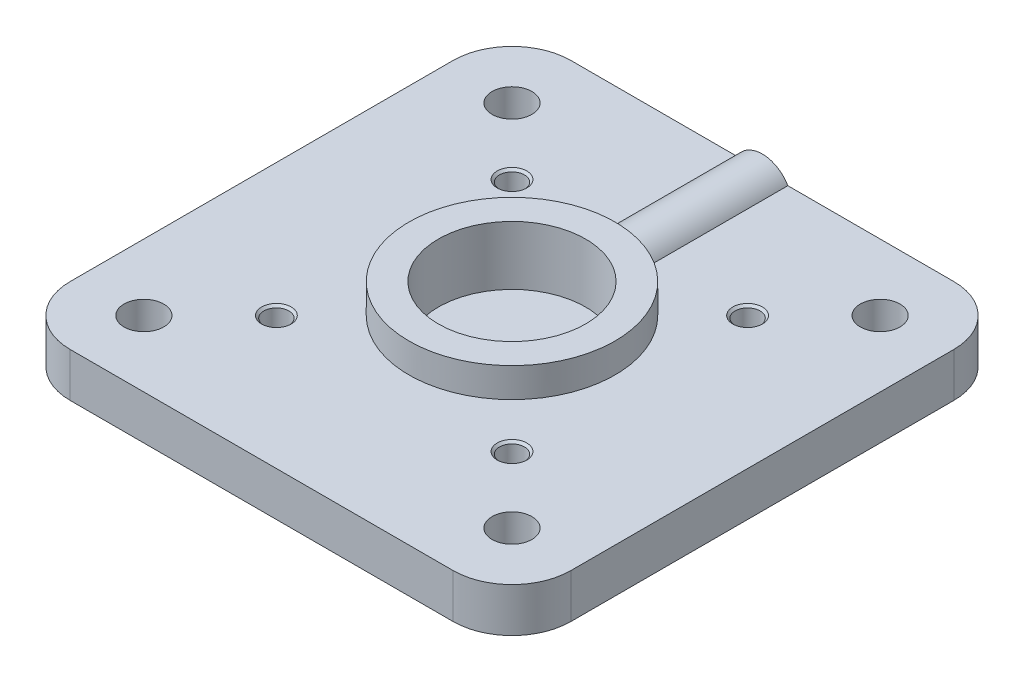
ISO-10303-21;
HEADER;
FILE_DESCRIPTION(('STEP AP214'),'2;1');
FILE_NAME('part.step','',(''),(''),'','','');
FILE_SCHEMA(('AUTOMOTIVE_DESIGN { 1 0 10303 214 1 1 1 1 }'));
ENDSEC;
DATA;
#1=APPLICATION_CONTEXT('core data for automotive mechanical design processes');
#2=APPLICATION_PROTOCOL_DEFINITION('international standard','automotive_design',2000,#1);
#3=PRODUCT_CONTEXT('',#1,'mechanical');
#4=PRODUCT('Part','Part','',(#3));
#5=PRODUCT_RELATED_PRODUCT_CATEGORY('part','',(#4));
#6=PRODUCT_DEFINITION_FORMATION('','',#4);
#7=PRODUCT_DEFINITION_CONTEXT('part definition',#1,'design');
#8=PRODUCT_DEFINITION('design','',#6,#7);
#9=PRODUCT_DEFINITION_SHAPE('','',#8);
#10=(LENGTH_UNIT() NAMED_UNIT(*) SI_UNIT(.MILLI.,.METRE.));
#11=(NAMED_UNIT(*) PLANE_ANGLE_UNIT() SI_UNIT($,.RADIAN.));
#12=(NAMED_UNIT(*) SI_UNIT($,.STERADIAN.) SOLID_ANGLE_UNIT());
#13=UNCERTAINTY_MEASURE_WITH_UNIT(LENGTH_MEASURE(1.E-05),#10,'distance_accuracy_value','');
#14=(GEOMETRIC_REPRESENTATION_CONTEXT(3) GLOBAL_UNCERTAINTY_ASSIGNED_CONTEXT((#13)) GLOBAL_UNIT_ASSIGNED_CONTEXT((#10,
#11,#12)) REPRESENTATION_CONTEXT('',''));
#15=CARTESIAN_POINT('',(0.,0.,0.));
#16=DIRECTION('',(0.,0.,1.));
#17=DIRECTION('',(1.,0.,0.));
#18=AXIS2_PLACEMENT_3D('',#15,#16,#17);
#19=CARTESIAN_POINT('',(-65.,15.,65.));
#20=DIRECTION('',(0.,-1.,0.));
#21=DIRECTION('',(0.,0.,-1.));
#22=AXIS2_PLACEMENT_3D('',#19,#20,#21);
#23=CYLINDRICAL_SURFACE('',#22,20.);
#24=CARTESIAN_POINT('',(-65.,0.,65.));
#25=DIRECTION('',(0.,1.,0.));
#26=DIRECTION('',(0.,0.,1.));
#27=AXIS2_PLACEMENT_3D('',#24,#25,#26);
#28=CIRCLE('',#27,20.);
#29=CARTESIAN_POINT('',(-85.,0.,64.9999999999999));
#30=VERTEX_POINT('',#29);
#31=CARTESIAN_POINT('',(-64.9999999999999,0.,85.));
#32=VERTEX_POINT('',#31);
#33=EDGE_CURVE('E157',#30,#32,#28,.T.);
#34=ORIENTED_EDGE('',*,*,#33,.T.);
#35=DIRECTION('',(0.,-1.,0.));
#36=VECTOR('',#35,1.);
#37=CARTESIAN_POINT('',(-64.9999999999999,15.,85.));
#38=LINE('',#37,#36);
#39=CARTESIAN_POINT('',(-64.9999999999999,15.,85.));
#40=VERTEX_POINT('',#39);
#41=EDGE_CURVE('E50',#40,#32,#38,.T.);
#42=ORIENTED_EDGE('',*,*,#41,.F.);
#43=CARTESIAN_POINT('',(-65.,15.,65.));
#44=DIRECTION('',(0.,1.,0.));
#45=DIRECTION('',(0.,0.,1.));
#46=AXIS2_PLACEMENT_3D('',#43,#44,#45);
#47=CIRCLE('',#46,20.);
#48=CARTESIAN_POINT('',(-85.,15.,64.9999999999999));
#49=VERTEX_POINT('',#48);
#50=EDGE_CURVE('E173',#49,#40,#47,.T.);
#51=ORIENTED_EDGE('',*,*,#50,.F.);
#52=DIRECTION('',(0.,-1.,0.));
#53=VECTOR('',#52,1.);
#54=CARTESIAN_POINT('',(-85.,15.,64.9999999999999));
#55=LINE('',#54,#53);
#56=EDGE_CURVE('E152',#49,#30,#55,.T.);
#57=ORIENTED_EDGE('',*,*,#56,.T.);
#58=EDGE_LOOP('',(#34,#42,#51,#57));
#59=FACE_BOUND('',#58,.T.);
#60=ADVANCED_FACE('F40',(#59),#23,.T.);
#61=CARTESIAN_POINT('',(-64.9999999999999,15.,85.));
#62=DIRECTION('',(0.,0.,-1.));
#63=DIRECTION('',(-1.,0.,0.));
#64=AXIS2_PLACEMENT_3D('',#61,#62,#63);
#65=PLANE('',#64);
#66=DIRECTION('',(1.,0.,0.));
#67=VECTOR('',#66,1.);
#68=CARTESIAN_POINT('',(-64.9999999999999,0.,85.));
#69=LINE('',#68,#67);
#70=CARTESIAN_POINT('',(64.9999999999998,0.,85.));
#71=VERTEX_POINT('',#70);
#72=EDGE_CURVE('E160',#32,#71,#69,.T.);
#73=ORIENTED_EDGE('',*,*,#72,.T.);
#74=DIRECTION('',(0.,-1.,0.));
#75=VECTOR('',#74,1.);
#76=CARTESIAN_POINT('',(64.9999999999998,15.,85.));
#77=LINE('',#76,#75);
#78=CARTESIAN_POINT('',(64.9999999999998,15.,85.));
#79=VERTEX_POINT('',#78);
#80=EDGE_CURVE('E183',#79,#71,#77,.T.);
#81=ORIENTED_EDGE('',*,*,#80,.F.);
#82=DIRECTION('',(1.,0.,0.));
#83=VECTOR('',#82,1.);
#84=CARTESIAN_POINT('',(-64.9999999999999,15.,85.));
#85=LINE('',#84,#83);
#86=EDGE_CURVE('E109',#40,#79,#85,.T.);
#87=ORIENTED_EDGE('',*,*,#86,.F.);
#88=ORIENTED_EDGE('',*,*,#41,.T.);
#89=EDGE_LOOP('',(#73,#81,#87,#88));
#90=FACE_BOUND('',#89,.T.);
#91=ADVANCED_FACE('F389',(#90),#65,.F.);
#92=CARTESIAN_POINT('',(65.,15.,65.));
#93=DIRECTION('',(0.,-1.,0.));
#94=DIRECTION('',(0.,0.,-1.));
#95=AXIS2_PLACEMENT_3D('',#92,#93,#94);
#96=CYLINDRICAL_SURFACE('',#95,20.);
#97=CARTESIAN_POINT('',(65.,0.,65.));
#98=DIRECTION('',(0.,1.,0.));
#99=DIRECTION('',(0.,0.,1.));
#100=AXIS2_PLACEMENT_3D('',#97,#98,#99);
#101=CIRCLE('',#100,20.);
#102=CARTESIAN_POINT('',(85.,0.,64.9999999999999));
#103=VERTEX_POINT('',#102);
#104=EDGE_CURVE('E163',#71,#103,#101,.T.);
#105=ORIENTED_EDGE('',*,*,#104,.T.);
#106=DIRECTION('',(0.,-1.,0.));
#107=VECTOR('',#106,1.);
#108=CARTESIAN_POINT('',(85.,15.0000000000001,64.9999999999999));
#109=LINE('',#108,#107);
#110=CARTESIAN_POINT('',(85.,15.0000000000001,64.9999999999999));
#111=VERTEX_POINT('',#110);
#112=EDGE_CURVE('E180',#111,#103,#109,.T.);
#113=ORIENTED_EDGE('',*,*,#112,.F.);
#114=CARTESIAN_POINT('',(65.,15.,65.));
#115=DIRECTION('',(0.,1.,0.));
#116=DIRECTION('',(0.,0.,1.));
#117=AXIS2_PLACEMENT_3D('',#114,#115,#116);
#118=CIRCLE('',#117,20.);
#119=EDGE_CURVE('E286',#79,#111,#118,.T.);
#120=ORIENTED_EDGE('',*,*,#119,.F.);
#121=ORIENTED_EDGE('',*,*,#80,.T.);
#122=EDGE_LOOP('',(#105,#113,#120,#121));
#123=FACE_BOUND('',#122,.T.);
#124=ADVANCED_FACE('F394',(#123),#96,.T.);
#125=CARTESIAN_POINT('',(85.,15.0000000000001,64.9999999999999));
#126=DIRECTION('',(-1.,0.,0.));
#127=DIRECTION('',(0.,0.,1.));
#128=AXIS2_PLACEMENT_3D('',#125,#126,#127);
#129=PLANE('',#128);
#130=DIRECTION('',(0.,0.,-1.));
#131=VECTOR('',#130,1.);
#132=CARTESIAN_POINT('',(85.,0.,64.9999999999999));
#133=LINE('',#132,#131);
#134=CARTESIAN_POINT('',(85.,0.,-64.9999999999999));
#135=VERTEX_POINT('',#134);
#136=EDGE_CURVE('E165',#103,#135,#133,.T.);
#137=ORIENTED_EDGE('',*,*,#136,.T.);
#138=DIRECTION('',(0.,-1.,0.));
#139=VECTOR('',#138,1.);
#140=CARTESIAN_POINT('',(85.,15.0000000000001,-64.9999999999999));
#141=LINE('',#140,#139);
#142=CARTESIAN_POINT('',(85.,15.0000000000001,-64.9999999999999));
#143=VERTEX_POINT('',#142);
#144=EDGE_CURVE('E177',#143,#135,#141,.T.);
#145=ORIENTED_EDGE('',*,*,#144,.F.);
#146=DIRECTION('',(0.,0.,-1.));
#147=VECTOR('',#146,1.);
#148=CARTESIAN_POINT('',(85.,15.0000000000001,64.9999999999999));
#149=LINE('',#148,#147);
#150=EDGE_CURVE('E288',#111,#143,#149,.T.);
#151=ORIENTED_EDGE('',*,*,#150,.F.);
#152=ORIENTED_EDGE('',*,*,#112,.T.);
#153=EDGE_LOOP('',(#137,#145,#151,#152));
#154=FACE_BOUND('',#153,.T.);
#155=ADVANCED_FACE('F405',(#154),#129,.F.);
#156=CARTESIAN_POINT('',(65.,15.,-65.));
#157=DIRECTION('',(0.,-1.,0.));
#158=DIRECTION('',(0.,0.,-1.));
#159=AXIS2_PLACEMENT_3D('',#156,#157,#158);
#160=CYLINDRICAL_SURFACE('',#159,20.);
#161=CARTESIAN_POINT('',(65.,0.,-65.));
#162=DIRECTION('',(0.,1.,0.));
#163=DIRECTION('',(0.,0.,1.));
#164=AXIS2_PLACEMENT_3D('',#161,#162,#163);
#165=CIRCLE('',#164,20.);
#166=CARTESIAN_POINT('',(64.9999999999998,0.,-85.));
#167=VERTEX_POINT('',#166);
#168=EDGE_CURVE('E167',#135,#167,#165,.T.);
#169=ORIENTED_EDGE('',*,*,#168,.T.);
#170=DIRECTION('',(0.,-1.,0.));
#171=VECTOR('',#170,1.);
#172=CARTESIAN_POINT('',(64.9999999999998,15.0000000000001,-85.));
#173=LINE('',#172,#171);
#174=CARTESIAN_POINT('',(64.9999999999998,15.0000000000001,-85.));
#175=VERTEX_POINT('',#174);
#176=EDGE_CURVE('E147',#175,#167,#173,.T.);
#177=ORIENTED_EDGE('',*,*,#176,.F.);
#178=CARTESIAN_POINT('',(65.,15.,-65.));
#179=DIRECTION('',(0.,1.,0.));
#180=DIRECTION('',(0.,0.,1.));
#181=AXIS2_PLACEMENT_3D('',#178,#179,#180);
#182=CIRCLE('',#181,20.);
#183=EDGE_CURVE('E137',#143,#175,#182,.T.);
#184=ORIENTED_EDGE('',*,*,#183,.F.);
#185=ORIENTED_EDGE('',*,*,#144,.T.);
#186=EDGE_LOOP('',(#169,#177,#184,#185));
#187=FACE_BOUND('',#186,.T.);
#188=ADVANCED_FACE('F296',(#187),#160,.T.);
#189=CARTESIAN_POINT('',(-64.9999999999999,15.0000000000001,-85.));
#190=DIRECTION('',(0.,0.,1.));
#191=DIRECTION('',(1.,0.,0.));
#192=AXIS2_PLACEMENT_3D('',#189,#190,#191);
#193=PLANE('',#192);
#194=CARTESIAN_POINT('',(0.,10.,-85.));
#195=DIRECTION('',(0.,0.,-1.));
#196=DIRECTION('',(-1.,0.,0.));
#197=AXIS2_PLACEMENT_3D('',#194,#195,#196);
#198=CIRCLE('',#197,6.);
#199=CARTESIAN_POINT('',(-6.,10.,-85.));
#200=VERTEX_POINT('',#199);
#201=EDGE_CURVE('E193',#200,#200,#198,.T.);
#202=ORIENTED_EDGE('',*,*,#201,.F.);
#203=EDGE_LOOP('',(#202));
#204=FACE_BOUND('',#203,.T.);
#205=DIRECTION('',(-1.,0.,0.));
#206=VECTOR('',#205,1.);
#207=CARTESIAN_POINT('',(-64.9999999999999,0.,-85.));
#208=LINE('',#207,#206);
#209=CARTESIAN_POINT('',(-64.9999999999999,0.,-85.));
#210=VERTEX_POINT('',#209);
#211=EDGE_CURVE('E144',#167,#210,#208,.T.);
#212=ORIENTED_EDGE('',*,*,#211,.T.);
#213=DIRECTION('',(0.,-1.,0.));
#214=VECTOR('',#213,1.);
#215=CARTESIAN_POINT('',(-64.9999999999999,15.0000000000001,-85.));
#216=LINE('',#215,#214);
#217=CARTESIAN_POINT('',(-64.9999999999999,15.0000000000001,-85.));
#218=VERTEX_POINT('',#217);
#219=EDGE_CURVE('E140',#218,#210,#216,.T.);
#220=ORIENTED_EDGE('',*,*,#219,.F.);
#221=DIRECTION('',(-1.,0.,0.));
#222=VECTOR('',#221,1.);
#223=CARTESIAN_POINT('',(-64.9999999999999,15.0000000000001,-85.));
#224=LINE('',#223,#222);
#225=CARTESIAN_POINT('',(-8.6602540378444,15.0000000000001,-85.));
#226=VERTEX_POINT('',#225);
#227=EDGE_CURVE('E124',#226,#218,#224,.T.);
#228=ORIENTED_EDGE('',*,*,#227,.F.);
#229=CARTESIAN_POINT('',(0.,10.,-85.));
#230=DIRECTION('',(0.,0.,-1.));
#231=DIRECTION('',(-1.,0.,0.));
#232=AXIS2_PLACEMENT_3D('',#229,#230,#231);
#233=CIRCLE('',#232,10.);
#234=CARTESIAN_POINT('',(8.6602540378444,15.0000000000001,-85.));
#235=VERTEX_POINT('',#234);
#236=EDGE_CURVE('E235',#226,#235,#233,.T.);
#237=ORIENTED_EDGE('',*,*,#236,.T.);
#238=EDGE_CURVE('E136',#175,#235,#224,.T.);
#239=ORIENTED_EDGE('',*,*,#238,.F.);
#240=ORIENTED_EDGE('',*,*,#176,.T.);
#241=EDGE_LOOP('',(#212,#220,#228,#237,#239,#240));
#242=FACE_BOUND('',#241,.T.);
#243=ADVANCED_FACE('F141',(#204,#242),#193,.F.);
#244=CARTESIAN_POINT('',(-65.,15.,-65.));
#245=DIRECTION('',(0.,-1.,0.));
#246=DIRECTION('',(0.,0.,-1.));
#247=AXIS2_PLACEMENT_3D('',#244,#245,#246);
#248=CYLINDRICAL_SURFACE('',#247,20.);
#249=CARTESIAN_POINT('',(-65.,0.,-65.));
#250=DIRECTION('',(0.,1.,0.));
#251=DIRECTION('',(0.,0.,1.));
#252=AXIS2_PLACEMENT_3D('',#249,#250,#251);
#253=CIRCLE('',#252,20.);
#254=CARTESIAN_POINT('',(-85.,0.,-64.9999999999999));
#255=VERTEX_POINT('',#254);
#256=EDGE_CURVE('E170',#210,#255,#253,.T.);
#257=ORIENTED_EDGE('',*,*,#256,.T.);
#258=DIRECTION('',(0.,-1.,0.));
#259=VECTOR('',#258,1.);
#260=CARTESIAN_POINT('',(-85.,15.,-64.9999999999999));
#261=LINE('',#260,#259);
#262=CARTESIAN_POINT('',(-85.,15.,-64.9999999999999));
#263=VERTEX_POINT('',#262);
#264=EDGE_CURVE('E148',#263,#255,#261,.T.);
#265=ORIENTED_EDGE('',*,*,#264,.F.);
#266=CARTESIAN_POINT('',(-65.,15.,-65.));
#267=DIRECTION('',(0.,1.,0.));
#268=DIRECTION('',(0.,0.,1.));
#269=AXIS2_PLACEMENT_3D('',#266,#267,#268);
#270=CIRCLE('',#269,20.);
#271=EDGE_CURVE('E130',#218,#263,#270,.T.);
#272=ORIENTED_EDGE('',*,*,#271,.F.);
#273=ORIENTED_EDGE('',*,*,#219,.T.);
#274=EDGE_LOOP('',(#257,#265,#272,#273));
#275=FACE_BOUND('',#274,.T.);
#276=ADVANCED_FACE('F150',(#275),#248,.T.);
#277=CARTESIAN_POINT('',(-85.,15.,64.9999999999999));
#278=DIRECTION('',(1.,0.,0.));
#279=DIRECTION('',(0.,0.,-1.));
#280=AXIS2_PLACEMENT_3D('',#277,#278,#279);
#281=PLANE('',#280);
#282=DIRECTION('',(0.,0.,1.));
#283=VECTOR('',#282,1.);
#284=CARTESIAN_POINT('',(-85.,0.,64.9999999999999));
#285=LINE('',#284,#283);
#286=EDGE_CURVE('E100',#255,#30,#285,.T.);
#287=ORIENTED_EDGE('',*,*,#286,.T.);
#288=ORIENTED_EDGE('',*,*,#56,.F.);
#289=DIRECTION('',(0.,0.,1.));
#290=VECTOR('',#289,1.);
#291=CARTESIAN_POINT('',(-85.,15.,64.9999999999999));
#292=LINE('',#291,#290);
#293=EDGE_CURVE('E67',#263,#49,#292,.T.);
#294=ORIENTED_EDGE('',*,*,#293,.F.);
#295=ORIENTED_EDGE('',*,*,#264,.T.);
#296=EDGE_LOOP('',(#287,#288,#294,#295));
#297=FACE_BOUND('',#296,.T.);
#298=ADVANCED_FACE('F373',(#297),#281,.F.);
#299=CARTESIAN_POINT('',(-65.,15.,65.));
#300=DIRECTION('',(0.,1.,0.));
#301=DIRECTION('',(0.,0.,1.));
#302=AXIS2_PLACEMENT_3D('',#299,#300,#301);
#303=PLANE('',#302);
#304=CARTESIAN_POINT('',(-40.,15.,-40.));
#305=DIRECTION('',(0.,1.,0.));
#306=DIRECTION('',(0.,0.,1.));
#307=AXIS2_PLACEMENT_3D('',#304,#305,#306);
#308=CIRCLE('',#307,5.025);
#309=CARTESIAN_POINT('',(-40.,15.,-34.975));
#310=VERTEX_POINT('',#309);
#311=EDGE_CURVE('E330',#310,#310,#308,.T.);
#312=ORIENTED_EDGE('',*,*,#311,.F.);
#313=EDGE_LOOP('',(#312));
#314=FACE_BOUND('',#313,.T.);
#315=CARTESIAN_POINT('',(40.,15.,-40.));
#316=DIRECTION('',(0.,1.,0.));
#317=DIRECTION('',(0.,0.,1.));
#318=AXIS2_PLACEMENT_3D('',#315,#316,#317);
#319=CIRCLE('',#318,5.025);
#320=CARTESIAN_POINT('',(40.,15.,-34.975));
#321=VERTEX_POINT('',#320);
#322=EDGE_CURVE('E323',#321,#321,#319,.T.);
#323=ORIENTED_EDGE('',*,*,#322,.F.);
#324=EDGE_LOOP('',(#323));
#325=FACE_BOUND('',#324,.T.);
#326=CARTESIAN_POINT('',(40.,15.,40.));
#327=DIRECTION('',(0.,1.,0.));
#328=DIRECTION('',(0.,0.,1.));
#329=AXIS2_PLACEMENT_3D('',#326,#327,#328);
#330=CIRCLE('',#329,5.025);
#331=CARTESIAN_POINT('',(40.,15.,45.025));
#332=VERTEX_POINT('',#331);
#333=EDGE_CURVE('E339',#332,#332,#330,.T.);
#334=ORIENTED_EDGE('',*,*,#333,.F.);
#335=EDGE_LOOP('',(#334));
#336=FACE_BOUND('',#335,.T.);
#337=CARTESIAN_POINT('',(-40.,15.,40.));
#338=DIRECTION('',(0.,1.,0.));
#339=DIRECTION('',(0.,0.,1.));
#340=AXIS2_PLACEMENT_3D('',#337,#338,#339);
#341=CIRCLE('',#340,5.025);
#342=CARTESIAN_POINT('',(-40.,15.,45.025));
#343=VERTEX_POINT('',#342);
#344=EDGE_CURVE('E348',#343,#343,#341,.T.);
#345=ORIENTED_EDGE('',*,*,#344,.F.);
#346=EDGE_LOOP('',(#345));
#347=FACE_BOUND('',#346,.T.);
#348=DIRECTION('',(0.,0.,-1.));
#349=VECTOR('',#348,1.);
#350=CARTESIAN_POINT('',(8.66025403784439,15.,500000.));
#351=LINE('',#350,#349);
#352=CARTESIAN_POINT('',(8.6602540378444,15.,-33.9116499156263));
#353=VERTEX_POINT('',#352);
#354=EDGE_CURVE('E236',#235,#353,#351,.F.);
#355=ORIENTED_EDGE('',*,*,#354,.T.);
#356=CARTESIAN_POINT('',(0.,15.,0.));
#357=DIRECTION('',(0.,1.,0.));
#358=DIRECTION('',(0.,0.,1.));
#359=AXIS2_PLACEMENT_3D('',#356,#357,#358);
#360=CIRCLE('',#359,35.);
#361=CARTESIAN_POINT('',(-8.6602540378444,15.,-33.9116499156263));
#362=VERTEX_POINT('',#361);
#363=EDGE_CURVE('E279',#362,#353,#360,.T.);
#364=ORIENTED_EDGE('',*,*,#363,.F.);
#365=DIRECTION('',(0.,0.,-1.));
#366=VECTOR('',#365,1.);
#367=CARTESIAN_POINT('',(-8.66025403784439,15.,500000.));
#368=LINE('',#367,#366);
#369=EDGE_CURVE('E58',#362,#226,#368,.T.);
#370=ORIENTED_EDGE('',*,*,#369,.T.);
#371=ORIENTED_EDGE('',*,*,#227,.T.);
#372=ORIENTED_EDGE('',*,*,#271,.T.);
#373=ORIENTED_EDGE('',*,*,#293,.T.);
#374=ORIENTED_EDGE('',*,*,#50,.T.);
#375=ORIENTED_EDGE('',*,*,#86,.T.);
#376=ORIENTED_EDGE('',*,*,#119,.T.);
#377=ORIENTED_EDGE('',*,*,#150,.T.);
#378=ORIENTED_EDGE('',*,*,#183,.T.);
#379=ORIENTED_EDGE('',*,*,#238,.T.);
#380=EDGE_LOOP('',(#355,#364,#370,#371,#372,#373,#374,#375,#376,#377,#378,#379));
#381=FACE_BOUND('',#380,.T.);
#382=CARTESIAN_POINT('',(-62.5,15.0000000000001,62.5));
#383=DIRECTION('',(0.,1.,0.));
#384=DIRECTION('',(0.,0.,1.));
#385=AXIS2_PLACEMENT_3D('',#382,#383,#384);
#386=CIRCLE('',#385,6.75);
#387=CARTESIAN_POINT('',(-62.5,15.0000000000001,69.25));
#388=VERTEX_POINT('',#387);
#389=EDGE_CURVE('E238',#388,#388,#386,.T.);
#390=ORIENTED_EDGE('',*,*,#389,.F.);
#391=EDGE_LOOP('',(#390));
#392=FACE_BOUND('',#391,.T.);
#393=CARTESIAN_POINT('',(62.5,15.,62.5));
#394=DIRECTION('',(0.,1.,0.));
#395=DIRECTION('',(0.,0.,1.));
#396=AXIS2_PLACEMENT_3D('',#393,#394,#395);
#397=CIRCLE('',#396,6.75);
#398=CARTESIAN_POINT('',(62.5,15.,69.25));
#399=VERTEX_POINT('',#398);
#400=EDGE_CURVE('E246',#399,#399,#397,.T.);
#401=ORIENTED_EDGE('',*,*,#400,.F.);
#402=EDGE_LOOP('',(#401));
#403=FACE_BOUND('',#402,.T.);
#404=CARTESIAN_POINT('',(62.5,15.,-62.5));
#405=DIRECTION('',(0.,1.,0.));
#406=DIRECTION('',(0.,0.,1.));
#407=AXIS2_PLACEMENT_3D('',#404,#405,#406);
#408=CIRCLE('',#407,6.75);
#409=CARTESIAN_POINT('',(62.5,15.,-55.75));
#410=VERTEX_POINT('',#409);
#411=EDGE_CURVE('E252',#410,#410,#408,.T.);
#412=ORIENTED_EDGE('',*,*,#411,.F.);
#413=EDGE_LOOP('',(#412));
#414=FACE_BOUND('',#413,.T.);
#415=CARTESIAN_POINT('',(-62.5,15.0000000000001,-62.5));
#416=DIRECTION('',(0.,1.,0.));
#417=DIRECTION('',(0.,0.,1.));
#418=AXIS2_PLACEMENT_3D('',#415,#416,#417);
#419=CIRCLE('',#418,6.75);
#420=CARTESIAN_POINT('',(-62.5,15.0000000000001,-55.75));
#421=VERTEX_POINT('',#420);
#422=EDGE_CURVE('E258',#421,#421,#419,.T.);
#423=ORIENTED_EDGE('',*,*,#422,.F.);
#424=EDGE_LOOP('',(#423));
#425=FACE_BOUND('',#424,.T.);
#426=ADVANCED_FACE('F127',(#314,#325,#336,#347,#381,#392,#403,#414,#425),#303,.T.);
#427=CARTESIAN_POINT('',(-65.,0.,65.));
#428=DIRECTION('',(0.,1.,0.));
#429=DIRECTION('',(0.,0.,1.));
#430=AXIS2_PLACEMENT_3D('',#427,#428,#429);
#431=PLANE('',#430);
#432=CARTESIAN_POINT('',(-62.5,0.,62.5));
#433=DIRECTION('',(0.,1.,0.));
#434=DIRECTION('',(0.,0.,1.));
#435=AXIS2_PLACEMENT_3D('',#432,#433,#434);
#436=CIRCLE('',#435,6.75);
#437=CARTESIAN_POINT('',(-62.5,0.,69.25));
#438=VERTEX_POINT('',#437);
#439=EDGE_CURVE('E243',#438,#438,#436,.F.);
#440=ORIENTED_EDGE('',*,*,#439,.F.);
#441=EDGE_LOOP('',(#440));
#442=FACE_BOUND('',#441,.T.);
#443=CARTESIAN_POINT('',(62.5,0.,62.5));
#444=DIRECTION('',(0.,1.,0.));
#445=DIRECTION('',(0.,0.,1.));
#446=AXIS2_PLACEMENT_3D('',#443,#444,#445);
#447=CIRCLE('',#446,6.75);
#448=CARTESIAN_POINT('',(62.5,0.,69.25));
#449=VERTEX_POINT('',#448);
#450=EDGE_CURVE('E249',#449,#449,#447,.F.);
#451=ORIENTED_EDGE('',*,*,#450,.F.);
#452=EDGE_LOOP('',(#451));
#453=FACE_BOUND('',#452,.T.);
#454=CARTESIAN_POINT('',(62.5,0.,-62.5));
#455=DIRECTION('',(0.,1.,0.));
#456=DIRECTION('',(0.,0.,1.));
#457=AXIS2_PLACEMENT_3D('',#454,#455,#456);
#458=CIRCLE('',#457,6.75);
#459=CARTESIAN_POINT('',(62.5,0.,-55.75));
#460=VERTEX_POINT('',#459);
#461=EDGE_CURVE('E255',#460,#460,#458,.F.);
#462=ORIENTED_EDGE('',*,*,#461,.F.);
#463=EDGE_LOOP('',(#462));
#464=FACE_BOUND('',#463,.T.);
#465=CARTESIAN_POINT('',(-62.5,0.,-62.5));
#466=DIRECTION('',(0.,1.,0.));
#467=DIRECTION('',(0.,0.,1.));
#468=AXIS2_PLACEMENT_3D('',#465,#466,#467);
#469=CIRCLE('',#468,6.75);
#470=CARTESIAN_POINT('',(-62.5,0.,-55.75));
#471=VERTEX_POINT('',#470);
#472=EDGE_CURVE('E261',#471,#471,#469,.F.);
#473=ORIENTED_EDGE('',*,*,#472,.F.);
#474=EDGE_LOOP('',(#473));
#475=FACE_BOUND('',#474,.T.);
#476=CARTESIAN_POINT('',(0.,0.,0.));
#477=DIRECTION('',(0.,1.,0.));
#478=DIRECTION('',(0.,0.,1.));
#479=AXIS2_PLACEMENT_3D('',#476,#477,#478);
#480=CIRCLE('',#479,65.);
#481=CARTESIAN_POINT('',(0.,0.,65.));
#482=VERTEX_POINT('',#481);
#483=EDGE_CURVE('E12',#482,#482,#480,.F.);
#484=ORIENTED_EDGE('',*,*,#483,.F.);
#485=EDGE_LOOP('',(#484));
#486=FACE_BOUND('',#485,.T.);
#487=ORIENTED_EDGE('',*,*,#33,.F.);
#488=ORIENTED_EDGE('',*,*,#286,.F.);
#489=ORIENTED_EDGE('',*,*,#256,.F.);
#490=ORIENTED_EDGE('',*,*,#211,.F.);
#491=ORIENTED_EDGE('',*,*,#168,.F.);
#492=ORIENTED_EDGE('',*,*,#136,.F.);
#493=ORIENTED_EDGE('',*,*,#104,.F.);
#494=ORIENTED_EDGE('',*,*,#72,.F.);
#495=EDGE_LOOP('',(#487,#488,#489,#490,#491,#492,#493,#494));
#496=FACE_BOUND('',#495,.T.);
#497=ADVANCED_FACE('F372',(#442,#453,#464,#475,#486,#496),#431,.F.);
#498=CARTESIAN_POINT('',(0.,25.,0.));
#499=DIRECTION('',(0.,-1.,0.));
#500=DIRECTION('',(0.,0.,-1.));
#501=AXIS2_PLACEMENT_3D('',#498,#499,#500);
#502=CYLINDRICAL_SURFACE('',#501,35.);
#503=CARTESIAN_POINT('',(0.,25.,0.));
#504=DIRECTION('',(0.,1.,0.));
#505=DIRECTION('',(0.,0.,1.));
#506=AXIS2_PLACEMENT_3D('',#503,#504,#505);
#507=CIRCLE('',#506,35.);
#508=CARTESIAN_POINT('',(0.,25.,35.));
#509=VERTEX_POINT('',#508);
#510=EDGE_CURVE('E161',#509,#509,#507,.T.);
#511=ORIENTED_EDGE('',*,*,#510,.F.);
#512=EDGE_LOOP('',(#511));
#513=FACE_BOUND('',#512,.T.);
#514=ORIENTED_EDGE('',*,*,#363,.T.);
#515=CARTESIAN_POINT('',(-8.6602540378444,15.,-33.9116499156263));
#516=CARTESIAN_POINT('',(-8.51841412909811,15.245718019922,-33.9478688289762));
#517=CARTESIAN_POINT('',(-8.36619928123129,15.485171280843,-33.9857973550504));
#518=CARTESIAN_POINT('',(-8.04221339376253,15.9500372223212,-34.0639197165891));
#519=CARTESIAN_POINT('',(-7.87044422952049,16.1754512461112,-34.1041133346332));
#520=CARTESIAN_POINT('',(-7.5084840967367,16.6108133980419,-34.1856264768967));
#521=CARTESIAN_POINT('',(-7.31828991013483,16.8207588131668,-34.2269461968887));
#522=CARTESIAN_POINT('',(-6.92077827503282,17.2237752559288,-34.3095326827882));
#523=CARTESIAN_POINT('',(-6.71346067260571,17.4168461318442,-34.3507994482162));
#524=CARTESIAN_POINT('',(-6.28297110372061,17.7848893314931,-34.4321400141357));
#525=CARTESIAN_POINT('',(-6.05979281640192,17.9598543706201,-34.4722133298785));
#526=CARTESIAN_POINT('',(-5.59911593540322,18.2903716806461,-34.5500283515032));
#527=CARTESIAN_POINT('',(-5.36161763110667,18.4459243436418,-34.5877701044709));
#528=CARTESIAN_POINT('',(-4.87396535500265,18.736416618776,-34.6598496448909));
#529=CARTESIAN_POINT('',(-4.62381644999331,18.871364397861,-34.6941887790999));
#530=CARTESIAN_POINT('',(-4.11248003199118,19.1196645826902,-34.7585082439798));
#531=CARTESIAN_POINT('',(-3.85129269711296,19.2330173367264,-34.7884886449481));
#532=CARTESIAN_POINT('',(-3.322457379361,19.4361368608936,-34.8429505010101));
#533=CARTESIAN_POINT('',(-3.05490359332422,19.5261344383932,-34.8674853910416));
#534=CARTESIAN_POINT('',(-2.51270435812473,19.6832836084661,-34.9107471868847));
#535=CARTESIAN_POINT('',(-2.23805893510995,19.7504352852627,-34.9294741141078));
#536=CARTESIAN_POINT('',(-1.6837290425724,19.8612851660395,-34.9605793919666));
#537=CARTESIAN_POINT('',(-1.40404477113254,19.9049842898961,-34.9729579916012));
#538=CARTESIAN_POINT('',(-0.84176669142574,19.9685239780212,-34.9910065249648));
#539=CARTESIAN_POINT('',(-0.559172965721722,19.9883652174438,-34.9966766485368));
#540=CARTESIAN_POINT('',(-0.00315463098294363,20.003730341976,-35.0010653456953));
#541=CARTESIAN_POINT('',(0.270245682413897,20.0000789440497,-35.0000196816069));
#542=CARTESIAN_POINT('',(0.815726138832504,19.9704159222182,-34.991555991496));
#543=CARTESIAN_POINT('',(1.08780631444582,19.9444048531823,-34.9841381236038));
#544=CARTESIAN_POINT('',(1.62864469224877,19.8702587556264,-34.9631341173628));
#545=CARTESIAN_POINT('',(1.89740343157172,19.8221273537223,-34.9495489901371));
#546=CARTESIAN_POINT('',(2.42974815380335,19.7041564493265,-34.9165784190543));
#547=CARTESIAN_POINT('',(2.69333411231134,19.6343168444606,-34.8971929478431));
#548=CARTESIAN_POINT('',(3.21195651404246,19.4739940504567,-34.8532733227822));
#549=CARTESIAN_POINT('',(3.46703482726684,19.3836374844751,-34.8287708208873));
#550=CARTESIAN_POINT('',(3.96870541663831,19.1827236839155,-34.7751785429163));
#551=CARTESIAN_POINT('',(4.2152947704802,19.0721595739608,-34.7460872060065));
#552=CARTESIAN_POINT('',(4.69842849865022,18.8316259892946,-34.6840614147341));
#553=CARTESIAN_POINT('',(4.93496903906232,18.7016491919804,-34.6511255112024));
#554=CARTESIAN_POINT('',(5.39646516457366,18.4232294147803,-34.5822585408565));
#555=CARTESIAN_POINT('',(5.62142035914342,18.2747858129738,-34.5463273731821));
#556=CARTESIAN_POINT('',(6.06546514693656,17.9553338036537,-34.4711831492361));
#557=CARTESIAN_POINT('',(6.28413019364392,17.7837511720637,-34.4319015560465));
#558=CARTESIAN_POINT('',(6.70623879282035,17.4231654649054,-34.3521831845155));
#559=CARTESIAN_POINT('',(6.90968717167265,17.2341679557578,-34.311746778126));
#560=CARTESIAN_POINT('',(7.29991428351248,16.8401784440247,-34.2308474718619));
#561=CARTESIAN_POINT('',(7.48671354352011,16.6352067378643,-34.1903846683479));
#562=CARTESIAN_POINT('',(7.84266198834641,16.2104246537024,-34.1104956027841));
#563=CARTESIAN_POINT('',(8.0118202498104,15.9906220033619,-34.0710688155728));
#564=CARTESIAN_POINT('',(8.25878123561068,15.6405159618085,-34.0117711290426));
#565=CARTESIAN_POINT('',(8.34316656576165,15.5149317532625,-33.9911552853639));
#566=CARTESIAN_POINT('',(8.50609083104541,15.2601564243327,-33.9507502317283));
#567=CARTESIAN_POINT('',(8.58463798896016,15.1309707434104,-33.9309598770496));
#568=CARTESIAN_POINT('',(8.6602540378444,15.,-33.9116499156263));
#569=B_SPLINE_CURVE_WITH_KNOTS('',3,(#515,#516,#517,#518,#519,#520,#521,#522,#523,#524,#525,
#526,#527,#528,#529,#530,#531,#532,#533,#534,#535,#536,#537,#538,#539,#540,#541,#542,#543,#544,
#545,#546,#547,#548,#549,#550,#551,#552,#553,#554,#555,#556,#557,#558,#559,#560,#561,#562,#563,
#564,#565,#566,#567,#568),.UNSPECIFIED.,.F.,.F.,(4,2,2,2,2,2,2,2,2,2,2,2,2,2,2,2,2,2,2,2,2,2,2,
2,2,2,4),(0.,0.857773306787484,1.71546441788105,2.57330560178806,3.43115449789899,
4.28934720537005,5.14752257601996,6.00535691255472,6.86317741247509,7.71216650562834,
8.56115246887901,9.41010513002821,10.2590337661004,11.0783270881405,11.8976000794925,
12.7167387993962,13.5358813823556,14.3500996753125,15.164595513829,15.9793993655215,
16.7942306654178,17.6353967556443,18.4762949055145,19.3161415241949,20.1555538706905,
20.6135148999666,21.0708181853006),.UNSPECIFIED.);
#570=EDGE_CURVE('E230',#362,#353,#569,.T.);
#571=ORIENTED_EDGE('',*,*,#570,.F.);
#572=EDGE_LOOP('',(#514,#571));
#573=FACE_BOUND('',#572,.T.);
#574=ADVANCED_FACE('F380',(#513,#573),#502,.T.);
#575=CARTESIAN_POINT('',(0.,25.,0.));
#576=DIRECTION('',(0.,1.,0.));
#577=DIRECTION('',(0.,0.,1.));
#578=AXIS2_PLACEMENT_3D('',#575,#576,#577);
#579=PLANE('',#578);
#580=CARTESIAN_POINT('',(0.,25.,0.));
#581=DIRECTION('',(0.,1.,0.));
#582=DIRECTION('',(0.,0.,1.));
#583=AXIS2_PLACEMENT_3D('',#580,#581,#582);
#584=CIRCLE('',#583,25.);
#585=CARTESIAN_POINT('',(0.,25.,25.));
#586=VERTEX_POINT('',#585);
#587=EDGE_CURVE('E264',#586,#586,#584,.T.);
#588=ORIENTED_EDGE('',*,*,#587,.F.);
#589=EDGE_LOOP('',(#588));
#590=FACE_BOUND('',#589,.T.);
#591=ORIENTED_EDGE('',*,*,#510,.T.);
#592=EDGE_LOOP('',(#591));
#593=FACE_BOUND('',#592,.T.);
#594=ADVANCED_FACE('F441',(#590,#593),#579,.T.);
#595=CARTESIAN_POINT('',(0.,-10.,0.));
#596=DIRECTION('',(0.,-1.,0.));
#597=DIRECTION('',(0.,0.,-1.));
#598=AXIS2_PLACEMENT_3D('',#595,#596,#597);
#599=PLANE('',#598);
#600=CARTESIAN_POINT('',(0.,-10.,0.));
#601=DIRECTION('',(0.,-1.,0.));
#602=DIRECTION('',(0.,0.,-1.));
#603=AXIS2_PLACEMENT_3D('',#600,#601,#602);
#604=CIRCLE('',#603,65.);
#605=CARTESIAN_POINT('',(0.,-10.,-65.));
#606=VERTEX_POINT('',#605);
#607=EDGE_CURVE('E274',#606,#606,#604,.T.);
#608=ORIENTED_EDGE('',*,*,#607,.T.);
#609=EDGE_LOOP('',(#608));
#610=FACE_BOUND('',#609,.T.);
#611=CARTESIAN_POINT('',(0.,-10.,0.));
#612=DIRECTION('',(0.,-1.,0.));
#613=DIRECTION('',(0.,0.,-1.));
#614=AXIS2_PLACEMENT_3D('',#611,#612,#613);
#615=CIRCLE('',#614,50.);
#616=CARTESIAN_POINT('',(0.,-10.,-50.));
#617=VERTEX_POINT('',#616);
#618=EDGE_CURVE('E271',#617,#617,#615,.T.);
#619=ORIENTED_EDGE('',*,*,#618,.F.);
#620=EDGE_LOOP('',(#619));
#621=FACE_BOUND('',#620,.T.);
#622=ADVANCED_FACE('F448',(#610,#621),#599,.T.);
#623=CARTESIAN_POINT('',(0.,-10.,0.));
#624=DIRECTION('',(0.,1.,0.));
#625=DIRECTION('',(0.,0.,1.));
#626=AXIS2_PLACEMENT_3D('',#623,#624,#625);
#627=CYLINDRICAL_SURFACE('',#626,65.);
#628=ORIENTED_EDGE('',*,*,#607,.F.);
#629=EDGE_LOOP('',(#628));
#630=FACE_BOUND('',#629,.T.);
#631=ORIENTED_EDGE('',*,*,#483,.T.);
#632=EDGE_LOOP('',(#631));
#633=FACE_BOUND('',#632,.T.);
#634=ADVANCED_FACE('F466',(#630,#633),#627,.T.);
#635=CARTESIAN_POINT('',(0.,-10.,0.));
#636=DIRECTION('',(0.,1.,0.));
#637=DIRECTION('',(0.,0.,1.));
#638=AXIS2_PLACEMENT_3D('',#635,#636,#637);
#639=CYLINDRICAL_SURFACE('',#638,50.);
#640=ORIENTED_EDGE('',*,*,#618,.T.);
#641=EDGE_LOOP('',(#640));
#642=FACE_BOUND('',#641,.T.);
#643=CARTESIAN_POINT('',(0.,0.,0.));
#644=DIRECTION('',(0.,-1.,0.));
#645=DIRECTION('',(0.,0.,-1.));
#646=AXIS2_PLACEMENT_3D('',#643,#644,#645);
#647=CIRCLE('',#646,50.);
#648=CARTESIAN_POINT('',(0.,0.,-50.));
#649=VERTEX_POINT('',#648);
#650=EDGE_CURVE('E268',#649,#649,#647,.T.);
#651=ORIENTED_EDGE('',*,*,#650,.F.);
#652=EDGE_LOOP('',(#651));
#653=FACE_BOUND('',#652,.T.);
#654=ADVANCED_FACE('F458',(#642,#653),#639,.F.);
#655=CARTESIAN_POINT('',(0.,0.,-43.));
#656=DIRECTION('',(0.,-1.,0.));
#657=DIRECTION('',(0.,0.,-1.));
#658=AXIS2_PLACEMENT_3D('',#655,#656,#657);
#659=CIRCLE('',#658,3.);
#660=CARTESIAN_POINT('',(0.,0.,-46.));
#661=VERTEX_POINT('',#660);
#662=EDGE_CURVE('E198',#661,#661,#659,.T.);
#663=ORIENTED_EDGE('',*,*,#662,.F.);
#664=EDGE_LOOP('',(#663));
#665=FACE_BOUND('',#664,.T.);
#666=ORIENTED_EDGE('',*,*,#650,.T.);
#667=EDGE_LOOP('',(#666));
#668=FACE_BOUND('',#667,.T.);
#669=ADVANCED_FACE('F383',(#665,#668),#431,.F.);
#670=CARTESIAN_POINT('',(0.,5.,0.));
#671=DIRECTION('',(0.,1.,0.));
#672=DIRECTION('',(0.,0.,1.));
#673=AXIS2_PLACEMENT_3D('',#670,#671,#672);
#674=CYLINDRICAL_SURFACE('',#673,25.);
#675=CARTESIAN_POINT('',(0.,5.,0.));
#676=DIRECTION('',(0.,1.,0.));
#677=DIRECTION('',(0.,0.,1.));
#678=AXIS2_PLACEMENT_3D('',#675,#676,#677);
#679=CIRCLE('',#678,25.);
#680=CARTESIAN_POINT('',(0.,5.,25.));
#681=VERTEX_POINT('',#680);
#682=EDGE_CURVE('E265',#681,#681,#679,.T.);
#683=ORIENTED_EDGE('',*,*,#682,.F.);
#684=EDGE_LOOP('',(#683));
#685=FACE_BOUND('',#684,.T.);
#686=ORIENTED_EDGE('',*,*,#587,.T.);
#687=EDGE_LOOP('',(#686));
#688=FACE_BOUND('',#687,.T.);
#689=ADVANCED_FACE('F457',(#685,#688),#674,.F.);
#690=CARTESIAN_POINT('',(0.,5.,0.));
#691=DIRECTION('',(0.,1.,0.));
#692=DIRECTION('',(0.,0.,1.));
#693=AXIS2_PLACEMENT_3D('',#690,#691,#692);
#694=PLANE('',#693);
#695=ORIENTED_EDGE('',*,*,#682,.T.);
#696=EDGE_LOOP('',(#695));
#697=FACE_BOUND('',#696,.T.);
#698=ADVANCED_FACE('F486',(#697),#694,.T.);
#699=CARTESIAN_POINT('',(-62.5,-10.001,-62.5));
#700=DIRECTION('',(0.,1.,0.));
#701=DIRECTION('',(0.,0.,1.));
#702=AXIS2_PLACEMENT_3D('',#699,#700,#701);
#703=CYLINDRICAL_SURFACE('',#702,6.75);
#704=ORIENTED_EDGE('',*,*,#422,.T.);
#705=EDGE_LOOP('',(#704));
#706=FACE_BOUND('',#705,.T.);
#707=ORIENTED_EDGE('',*,*,#472,.T.);
#708=EDGE_LOOP('',(#707));
#709=FACE_BOUND('',#708,.T.);
#710=ADVANCED_FACE('F494',(#706,#709),#703,.F.);
#711=CARTESIAN_POINT('',(62.5,-10.001,-62.5));
#712=DIRECTION('',(0.,1.,0.));
#713=DIRECTION('',(0.,0.,1.));
#714=AXIS2_PLACEMENT_3D('',#711,#712,#713);
#715=CYLINDRICAL_SURFACE('',#714,6.75);
#716=ORIENTED_EDGE('',*,*,#411,.T.);
#717=EDGE_LOOP('',(#716));
#718=FACE_BOUND('',#717,.T.);
#719=ORIENTED_EDGE('',*,*,#461,.T.);
#720=EDGE_LOOP('',(#719));
#721=FACE_BOUND('',#720,.T.);
#722=ADVANCED_FACE('F502',(#718,#721),#715,.F.);
#723=CARTESIAN_POINT('',(62.5,-10.001,62.5));
#724=DIRECTION('',(0.,1.,0.));
#725=DIRECTION('',(0.,0.,1.));
#726=AXIS2_PLACEMENT_3D('',#723,#724,#725);
#727=CYLINDRICAL_SURFACE('',#726,6.75);
#728=ORIENTED_EDGE('',*,*,#400,.T.);
#729=EDGE_LOOP('',(#728));
#730=FACE_BOUND('',#729,.T.);
#731=ORIENTED_EDGE('',*,*,#450,.T.);
#732=EDGE_LOOP('',(#731));
#733=FACE_BOUND('',#732,.T.);
#734=ADVANCED_FACE('F510',(#730,#733),#727,.F.);
#735=CARTESIAN_POINT('',(-62.5,-10.001,62.5));
#736=DIRECTION('',(0.,1.,0.));
#737=DIRECTION('',(0.,0.,1.));
#738=AXIS2_PLACEMENT_3D('',#735,#736,#737);
#739=CYLINDRICAL_SURFACE('',#738,6.75);
#740=ORIENTED_EDGE('',*,*,#389,.T.);
#741=EDGE_LOOP('',(#740));
#742=FACE_BOUND('',#741,.T.);
#743=ORIENTED_EDGE('',*,*,#439,.T.);
#744=EDGE_LOOP('',(#743));
#745=FACE_BOUND('',#744,.T.);
#746=ADVANCED_FACE('F227',(#742,#745),#739,.F.);
#747=CARTESIAN_POINT('',(0.,10.,500000.));
#748=DIRECTION('',(0.,0.,-1.));
#749=DIRECTION('',(-1.,0.,0.));
#750=AXIS2_PLACEMENT_3D('',#747,#748,#749);
#751=CYLINDRICAL_SURFACE('',#750,10.);
#752=ORIENTED_EDGE('',*,*,#354,.F.);
#753=ORIENTED_EDGE('',*,*,#236,.F.);
#754=ORIENTED_EDGE('',*,*,#369,.F.);
#755=ORIENTED_EDGE('',*,*,#570,.T.);
#756=EDGE_LOOP('',(#752,#753,#754,#755));
#757=FACE_BOUND('',#756,.T.);
#758=ADVANCED_FACE('F221',(#757),#751,.T.);
#759=CARTESIAN_POINT('',(0.,10.,-73.));
#760=DIRECTION('',(0.,0.,-1.));
#761=DIRECTION('',(-1.,0.,0.));
#762=AXIS2_PLACEMENT_3D('',#759,#760,#761);
#763=CONICAL_SURFACE('',#762,3.,0.244978663126864);
#764=CARTESIAN_POINT('',(0.,10.,-73.));
#765=DIRECTION('',(0.,0.,-1.));
#766=DIRECTION('',(-1.,0.,0.));
#767=AXIS2_PLACEMENT_3D('',#764,#765,#766);
#768=CIRCLE('',#767,3.);
#769=CARTESIAN_POINT('',(-3.,10.,-73.));
#770=VERTEX_POINT('',#769);
#771=EDGE_CURVE('E189',#770,#770,#768,.T.);
#772=ORIENTED_EDGE('',*,*,#771,.F.);
#773=EDGE_LOOP('',(#772));
#774=FACE_BOUND('',#773,.T.);
#775=ORIENTED_EDGE('',*,*,#201,.T.);
#776=EDGE_LOOP('',(#775));
#777=FACE_BOUND('',#776,.T.);
#778=ADVANCED_FACE('F211',(#774,#777),#763,.F.);
#779=CARTESIAN_POINT('',(0.,13.,-43.));
#780=DIRECTION('',(0.,-1.,0.));
#781=DIRECTION('',(0.,0.,-1.));
#782=AXIS2_PLACEMENT_3D('',#779,#780,#781);
#783=CYLINDRICAL_SURFACE('',#782,3.);
#784=ORIENTED_EDGE('',*,*,#662,.T.);
#785=EDGE_LOOP('',(#784));
#786=FACE_BOUND('',#785,.T.);
#787=CARTESIAN_POINT('',(0.,10.,-43.));
#788=DIRECTION('',(0.,0.707106781186547,-0.707106781186548));
#789=DIRECTION('',(0.,-0.707106781186547,-0.707106781186548));
#790=AXIS2_PLACEMENT_3D('',#787,#788,#789);
#791=ELLIPSE('',#790,4.24264068711929,3.);
#792=CARTESIAN_POINT('',(0.,7.00000000000001,-46.));
#793=VERTEX_POINT('',#792);
#794=EDGE_CURVE('E194',#793,#793,#791,.F.);
#795=ORIENTED_EDGE('',*,*,#794,.F.);
#796=EDGE_LOOP('',(#795));
#797=FACE_BOUND('',#796,.T.);
#798=ADVANCED_FACE('F220',(#786,#797),#783,.F.);
#799=CARTESIAN_POINT('',(0.,10.,-40.));
#800=DIRECTION('',(0.,0.,-1.));
#801=DIRECTION('',(-1.,0.,0.));
#802=AXIS2_PLACEMENT_3D('',#799,#800,#801);
#803=CYLINDRICAL_SURFACE('',#802,3.);
#804=ORIENTED_EDGE('',*,*,#794,.T.);
#805=EDGE_LOOP('',(#804));
#806=FACE_BOUND('',#805,.T.);
#807=ORIENTED_EDGE('',*,*,#771,.T.);
#808=EDGE_LOOP('',(#807));
#809=FACE_BOUND('',#808,.T.);
#810=ADVANCED_FACE('F190',(#806,#809),#803,.F.);
#811=CARTESIAN_POINT('',(-40.,-3.,40.));
#812=DIRECTION('',(0.,1.,0.));
#813=DIRECTION('',(0.,0.,1.));
#814=AXIS2_PLACEMENT_3D('',#811,#812,#813);
#815=CONICAL_SURFACE('',#814,4.25,1.02974425867665);
#816=CARTESIAN_POINT('',(-40.,-5.55365763086713,40.));
#817=VERTEX_POINT('',#816);
#818=VERTEX_LOOP('',#817);
#819=FACE_BOUND('',#818,.T.);
#820=CARTESIAN_POINT('',(-40.,-3.,40.));
#821=DIRECTION('',(0.,1.,0.));
#822=DIRECTION('',(0.,0.,1.));
#823=AXIS2_PLACEMENT_3D('',#820,#821,#822);
#824=CIRCLE('',#823,4.25);
#825=CARTESIAN_POINT('',(-40.,-3.,44.25));
#826=VERTEX_POINT('',#825);
#827=EDGE_CURVE('E203',#826,#826,#824,.T.);
#828=ORIENTED_EDGE('',*,*,#827,.T.);
#829=EDGE_LOOP('',(#828));
#830=FACE_BOUND('',#829,.T.);
#831=ADVANCED_FACE('F356',(#819,#830),#815,.F.);
#832=CARTESIAN_POINT('',(-40.,15.,40.));
#833=DIRECTION('',(0.,1.,0.));
#834=DIRECTION('',(0.,0.,1.));
#835=AXIS2_PLACEMENT_3D('',#832,#833,#834);
#836=CYLINDRICAL_SURFACE('',#835,4.24999999999999);
#837=ORIENTED_EDGE('',*,*,#827,.F.);
#838=EDGE_LOOP('',(#837));
#839=FACE_BOUND('',#838,.T.);
#840=CARTESIAN_POINT('',(-40.,14.225,40.));
#841=DIRECTION('',(0.,1.,0.));
#842=DIRECTION('',(0.,0.,1.));
#843=AXIS2_PLACEMENT_3D('',#840,#841,#842);
#844=CIRCLE('',#843,4.24999999999999);
#845=CARTESIAN_POINT('',(-40.,14.225,44.25));
#846=VERTEX_POINT('',#845);
#847=EDGE_CURVE('E351',#846,#846,#844,.T.);
#848=ORIENTED_EDGE('',*,*,#847,.T.);
#849=EDGE_LOOP('',(#848));
#850=FACE_BOUND('',#849,.T.);
#851=ADVANCED_FACE('F358',(#839,#850),#836,.F.);
#852=CARTESIAN_POINT('',(-40.,15.,40.));
#853=DIRECTION('',(0.,1.,0.));
#854=DIRECTION('',(0.,0.,1.));
#855=AXIS2_PLACEMENT_3D('',#852,#853,#854);
#856=CONICAL_SURFACE('',#855,5.025,0.785398163397447);
#857=ORIENTED_EDGE('',*,*,#847,.F.);
#858=EDGE_LOOP('',(#857));
#859=FACE_BOUND('',#858,.T.);
#860=ORIENTED_EDGE('',*,*,#344,.T.);
#861=EDGE_LOOP('',(#860));
#862=FACE_BOUND('',#861,.T.);
#863=ADVANCED_FACE('F361',(#859,#862),#856,.F.);
#864=CARTESIAN_POINT('',(40.,-3.,40.));
#865=DIRECTION('',(0.,1.,0.));
#866=DIRECTION('',(0.,0.,1.));
#867=AXIS2_PLACEMENT_3D('',#864,#865,#866);
#868=CONICAL_SURFACE('',#867,4.25,1.02974425867665);
#869=CARTESIAN_POINT('',(40.,-5.55365763086715,40.));
#870=VERTEX_POINT('',#869);
#871=VERTEX_LOOP('',#870);
#872=FACE_BOUND('',#871,.T.);
#873=CARTESIAN_POINT('',(40.,-3.,40.));
#874=DIRECTION('',(0.,1.,0.));
#875=DIRECTION('',(0.,0.,1.));
#876=AXIS2_PLACEMENT_3D('',#873,#874,#875);
#877=CIRCLE('',#876,4.25);
#878=CARTESIAN_POINT('',(40.,-3.,44.25));
#879=VERTEX_POINT('',#878);
#880=EDGE_CURVE('E345',#879,#879,#877,.T.);
#881=ORIENTED_EDGE('',*,*,#880,.T.);
#882=EDGE_LOOP('',(#881));
#883=FACE_BOUND('',#882,.T.);
#884=ADVANCED_FACE('F367',(#872,#883),#868,.F.);
#885=CARTESIAN_POINT('',(40.,15.,40.));
#886=DIRECTION('',(0.,1.,0.));
#887=DIRECTION('',(0.,0.,1.));
#888=AXIS2_PLACEMENT_3D('',#885,#886,#887);
#889=CYLINDRICAL_SURFACE('',#888,4.24999999999999);
#890=ORIENTED_EDGE('',*,*,#880,.F.);
#891=EDGE_LOOP('',(#890));
#892=FACE_BOUND('',#891,.T.);
#893=CARTESIAN_POINT('',(40.,14.225,40.));
#894=DIRECTION('',(0.,1.,0.));
#895=DIRECTION('',(0.,0.,1.));
#896=AXIS2_PLACEMENT_3D('',#893,#894,#895);
#897=CIRCLE('',#896,4.24999999999999);
#898=CARTESIAN_POINT('',(40.,14.225,44.25));
#899=VERTEX_POINT('',#898);
#900=EDGE_CURVE('E342',#899,#899,#897,.T.);
#901=ORIENTED_EDGE('',*,*,#900,.T.);
#902=EDGE_LOOP('',(#901));
#903=FACE_BOUND('',#902,.T.);
#904=ADVANCED_FACE('F579',(#892,#903),#889,.F.);
#905=CARTESIAN_POINT('',(40.,15.,40.));
#906=DIRECTION('',(0.,1.,0.));
#907=DIRECTION('',(0.,0.,1.));
#908=AXIS2_PLACEMENT_3D('',#905,#906,#907);
#909=CONICAL_SURFACE('',#908,5.025,0.785398163397447);
#910=ORIENTED_EDGE('',*,*,#900,.F.);
#911=EDGE_LOOP('',(#910));
#912=FACE_BOUND('',#911,.T.);
#913=ORIENTED_EDGE('',*,*,#333,.T.);
#914=EDGE_LOOP('',(#913));
#915=FACE_BOUND('',#914,.T.);
#916=ADVANCED_FACE('F587',(#912,#915),#909,.F.);
#917=CARTESIAN_POINT('',(40.,-3.,-40.));
#918=DIRECTION('',(0.,1.,0.));
#919=DIRECTION('',(0.,0.,1.));
#920=AXIS2_PLACEMENT_3D('',#917,#918,#919);
#921=CONICAL_SURFACE('',#920,4.25,1.02974425867665);
#922=CARTESIAN_POINT('',(40.,-5.55365763086713,-40.));
#923=VERTEX_POINT('',#922);
#924=VERTEX_LOOP('',#923);
#925=FACE_BOUND('',#924,.T.);
#926=CARTESIAN_POINT('',(40.,-3.,-40.));
#927=DIRECTION('',(0.,1.,0.));
#928=DIRECTION('',(0.,0.,1.));
#929=AXIS2_PLACEMENT_3D('',#926,#927,#928);
#930=CIRCLE('',#929,4.25);
#931=CARTESIAN_POINT('',(40.,-3.,-35.75));
#932=VERTEX_POINT('',#931);
#933=EDGE_CURVE('E336',#932,#932,#930,.T.);
#934=ORIENTED_EDGE('',*,*,#933,.T.);
#935=EDGE_LOOP('',(#934));
#936=FACE_BOUND('',#935,.T.);
#937=ADVANCED_FACE('F597',(#925,#936),#921,.F.);
#938=CARTESIAN_POINT('',(40.,15.,-40.));
#939=DIRECTION('',(0.,1.,0.));
#940=DIRECTION('',(0.,0.,1.));
#941=AXIS2_PLACEMENT_3D('',#938,#939,#940);
#942=CYLINDRICAL_SURFACE('',#941,4.24999999999999);
#943=ORIENTED_EDGE('',*,*,#933,.F.);
#944=EDGE_LOOP('',(#943));
#945=FACE_BOUND('',#944,.T.);
#946=CARTESIAN_POINT('',(40.,14.225,-40.));
#947=DIRECTION('',(0.,1.,0.));
#948=DIRECTION('',(0.,0.,1.));
#949=AXIS2_PLACEMENT_3D('',#946,#947,#948);
#950=CIRCLE('',#949,4.24999999999999);
#951=CARTESIAN_POINT('',(40.,14.225,-35.75));
#952=VERTEX_POINT('',#951);
#953=EDGE_CURVE('E327',#952,#952,#950,.T.);
#954=ORIENTED_EDGE('',*,*,#953,.T.);
#955=EDGE_LOOP('',(#954));
#956=FACE_BOUND('',#955,.T.);
#957=ADVANCED_FACE('F605',(#945,#956),#942,.F.);
#958=CARTESIAN_POINT('',(40.,15.,-40.));
#959=DIRECTION('',(0.,1.,0.));
#960=DIRECTION('',(0.,0.,1.));
#961=AXIS2_PLACEMENT_3D('',#958,#959,#960);
#962=CONICAL_SURFACE('',#961,5.025,0.785398163397447);
#963=ORIENTED_EDGE('',*,*,#953,.F.);
#964=EDGE_LOOP('',(#963));
#965=FACE_BOUND('',#964,.T.);
#966=ORIENTED_EDGE('',*,*,#322,.T.);
#967=EDGE_LOOP('',(#966));
#968=FACE_BOUND('',#967,.T.);
#969=ADVANCED_FACE('F317',(#965,#968),#962,.F.);
#970=CARTESIAN_POINT('',(-40.,-3.,-40.));
#971=DIRECTION('',(0.,1.,0.));
#972=DIRECTION('',(0.,0.,1.));
#973=AXIS2_PLACEMENT_3D('',#970,#971,#972);
#974=CONICAL_SURFACE('',#973,4.25,1.02974425867665);
#975=CARTESIAN_POINT('',(-40.,-5.55365763086711,-40.));
#976=VERTEX_POINT('',#975);
#977=VERTEX_LOOP('',#976);
#978=FACE_BOUND('',#977,.T.);
#979=CARTESIAN_POINT('',(-40.,-3.,-40.));
#980=DIRECTION('',(0.,1.,0.));
#981=DIRECTION('',(0.,0.,1.));
#982=AXIS2_PLACEMENT_3D('',#979,#980,#981);
#983=CIRCLE('',#982,4.25);
#984=CARTESIAN_POINT('',(-40.,-3.,-35.75));
#985=VERTEX_POINT('',#984);
#986=EDGE_CURVE('E321',#985,#985,#983,.T.);
#987=ORIENTED_EDGE('',*,*,#986,.T.);
#988=EDGE_LOOP('',(#987));
#989=FACE_BOUND('',#988,.T.);
#990=ADVANCED_FACE('F313',(#978,#989),#974,.F.);
#991=CARTESIAN_POINT('',(-40.,15.,-40.));
#992=DIRECTION('',(0.,1.,0.));
#993=DIRECTION('',(0.,0.,1.));
#994=AXIS2_PLACEMENT_3D('',#991,#992,#993);
#995=CYLINDRICAL_SURFACE('',#994,4.24999999999999);
#996=ORIENTED_EDGE('',*,*,#986,.F.);
#997=EDGE_LOOP('',(#996));
#998=FACE_BOUND('',#997,.T.);
#999=CARTESIAN_POINT('',(-40.,14.225,-40.));
#1000=DIRECTION('',(0.,1.,0.));
#1001=DIRECTION('',(0.,0.,1.));
#1002=AXIS2_PLACEMENT_3D('',#999,#1000,#1001);
#1003=CIRCLE('',#1002,4.24999999999999);
#1004=CARTESIAN_POINT('',(-40.,14.225,-35.75));
#1005=VERTEX_POINT('',#1004);
#1006=EDGE_CURVE('E324',#1005,#1005,#1003,.T.);
#1007=ORIENTED_EDGE('',*,*,#1006,.T.);
#1008=EDGE_LOOP('',(#1007));
#1009=FACE_BOUND('',#1008,.T.);
#1010=ADVANCED_FACE('F316',(#998,#1009),#995,.F.);
#1011=CARTESIAN_POINT('',(-40.,15.,-40.));
#1012=DIRECTION('',(0.,1.,0.));
#1013=DIRECTION('',(0.,0.,1.));
#1014=AXIS2_PLACEMENT_3D('',#1011,#1012,#1013);
#1015=CONICAL_SURFACE('',#1014,5.025,0.785398163397447);
#1016=ORIENTED_EDGE('',*,*,#1006,.F.);
#1017=EDGE_LOOP('',(#1016));
#1018=FACE_BOUND('',#1017,.T.);
#1019=ORIENTED_EDGE('',*,*,#311,.T.);
#1020=EDGE_LOOP('',(#1019));
#1021=FACE_BOUND('',#1020,.T.);
#1022=ADVANCED_FACE('F633',(#1018,#1021),#1015,.F.);
#1023=CLOSED_SHELL('',(#60,#91,#124,#155,#188,#243,#276,#298,#426,#497,#574,#594,#622,#634,#654,
#669,#689,#698,#710,#722,#734,#746,#758,#778,#798,#810,#831,#851,#863,#884,#904,#916,#937,#957,
#969,#990,#1010,#1022));
#1024=MANIFOLD_SOLID_BREP('B2',#1023);
#1025=ADVANCED_BREP_SHAPE_REPRESENTATION('',(#18,#1024),#14);
#1026=SHAPE_DEFINITION_REPRESENTATION(#9,#1025);
ENDSEC;
END-ISO-10303-21;
